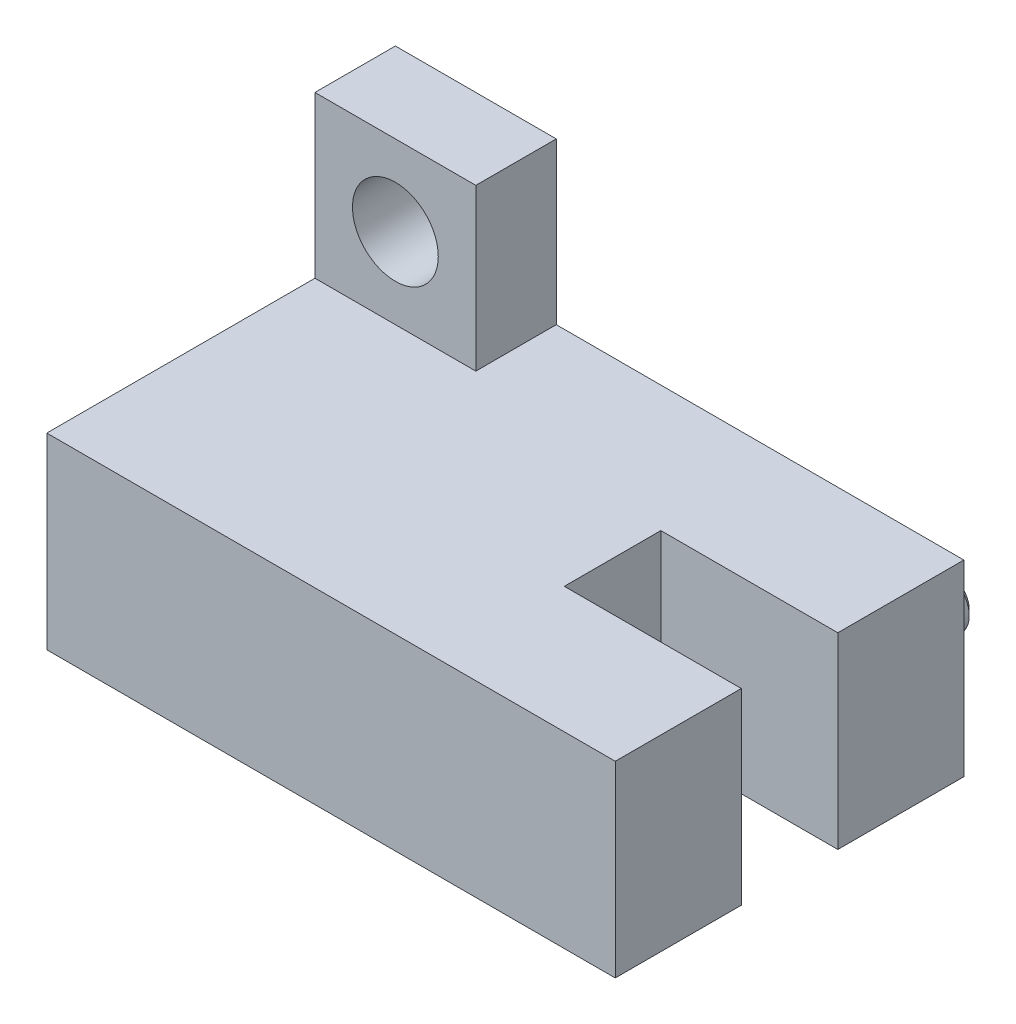
ISO-10303-21;
HEADER;
FILE_DESCRIPTION(('STEP AP214'),'2;1');
FILE_NAME('part.step','',(''),(''),'','','');
FILE_SCHEMA(('AUTOMOTIVE_DESIGN { 1 0 10303 214 1 1 1 1 }'));
ENDSEC;
DATA;
#1=APPLICATION_CONTEXT('core data for automotive mechanical design processes');
#2=APPLICATION_PROTOCOL_DEFINITION('international standard','automotive_design',2000,#1);
#3=PRODUCT_CONTEXT('',#1,'mechanical');
#4=PRODUCT('Part','Part','',(#3));
#5=PRODUCT_RELATED_PRODUCT_CATEGORY('part','',(#4));
#6=PRODUCT_DEFINITION_FORMATION('','',#4);
#7=PRODUCT_DEFINITION_CONTEXT('part definition',#1,'design');
#8=PRODUCT_DEFINITION('design','',#6,#7);
#9=PRODUCT_DEFINITION_SHAPE('','',#8);
#10=(LENGTH_UNIT() NAMED_UNIT(*) SI_UNIT(.MILLI.,.METRE.));
#11=(NAMED_UNIT(*) PLANE_ANGLE_UNIT() SI_UNIT($,.RADIAN.));
#12=(NAMED_UNIT(*) SI_UNIT($,.STERADIAN.) SOLID_ANGLE_UNIT());
#13=UNCERTAINTY_MEASURE_WITH_UNIT(LENGTH_MEASURE(1.E-05),#10,'distance_accuracy_value','');
#14=(GEOMETRIC_REPRESENTATION_CONTEXT(3) GLOBAL_UNCERTAINTY_ASSIGNED_CONTEXT((#13)) GLOBAL_UNIT_ASSIGNED_CONTEXT((#10,
#11,#12)) REPRESENTATION_CONTEXT('',''));
#15=CARTESIAN_POINT('',(0.,0.,0.));
#16=DIRECTION('',(0.,0.,1.));
#17=DIRECTION('',(1.,0.,0.));
#18=AXIS2_PLACEMENT_3D('',#15,#16,#17);
#19=CARTESIAN_POINT('',(-3.,-0.5,0.));
#20=DIRECTION('',(0.,0.,1.));
#21=DIRECTION('',(1.,0.,0.));
#22=AXIS2_PLACEMENT_3D('',#19,#20,#21);
#23=PLANE('',#22);
#24=CARTESIAN_POINT('',(0.,9.5,0.));
#25=DIRECTION('',(0.,0.,1.));
#26=DIRECTION('',(1.,0.,0.));
#27=AXIS2_PLACEMENT_3D('',#24,#25,#26);
#28=CIRCLE('',#27,1.6);
#29=CARTESIAN_POINT('',(1.6,9.5,0.));
#30=VERTEX_POINT('',#29);
#31=EDGE_CURVE('E181',#30,#30,#28,.T.);
#32=ORIENTED_EDGE('',*,*,#31,.T.);
#33=EDGE_LOOP('',(#32));
#34=FACE_BOUND('',#33,.T.);
#35=DIRECTION('',(0.,1.,0.));
#36=VECTOR('',#35,1.);
#37=CARTESIAN_POINT('',(3.,12.5,0.));
#38=LINE('',#37,#36);
#39=CARTESIAN_POINT('',(3.,6.5,0.));
#40=VERTEX_POINT('',#39);
#41=CARTESIAN_POINT('',(3.,12.5,0.));
#42=VERTEX_POINT('',#41);
#43=EDGE_CURVE('E192',#40,#42,#38,.T.);
#44=ORIENTED_EDGE('',*,*,#43,.F.);
#45=DIRECTION('',(1.,0.,0.));
#46=VECTOR('',#45,1.);
#47=CARTESIAN_POINT('',(-3.,6.5,0.));
#48=LINE('',#47,#46);
#49=CARTESIAN_POINT('',(18.2,6.5,0.));
#50=VERTEX_POINT('',#49);
#51=EDGE_CURVE('E151',#40,#50,#48,.T.);
#52=ORIENTED_EDGE('',*,*,#51,.T.);
#53=DIRECTION('',(0.,-1.,0.));
#54=VECTOR('',#53,1.);
#55=CARTESIAN_POINT('',(18.2,-0.500000000000003,0.));
#56=LINE('',#55,#54);
#57=CARTESIAN_POINT('',(18.2,-0.500000000000003,0.));
#58=VERTEX_POINT('',#57);
#59=EDGE_CURVE('E154',#50,#58,#56,.T.);
#60=ORIENTED_EDGE('',*,*,#59,.T.);
#61=DIRECTION('',(1.,0.,0.));
#62=VECTOR('',#61,1.);
#63=CARTESIAN_POINT('',(-3.,-0.5,0.));
#64=LINE('',#63,#62);
#65=CARTESIAN_POINT('',(-3.,-0.5,0.));
#66=VERTEX_POINT('',#65);
#67=EDGE_CURVE('E189',#66,#58,#64,.T.);
#68=ORIENTED_EDGE('',*,*,#67,.F.);
#69=DIRECTION('',(0.,-1.,0.));
#70=VECTOR('',#69,1.);
#71=CARTESIAN_POINT('',(-3.,12.5,0.));
#72=LINE('',#71,#70);
#73=CARTESIAN_POINT('',(-3.,12.5,0.));
#74=VERTEX_POINT('',#73);
#75=EDGE_CURVE('E187',#74,#66,#72,.T.);
#76=ORIENTED_EDGE('',*,*,#75,.F.);
#77=DIRECTION('',(-1.,0.,0.));
#78=VECTOR('',#77,1.);
#79=CARTESIAN_POINT('',(-3.,12.5,0.));
#80=LINE('',#79,#78);
#81=EDGE_CURVE('E194',#42,#74,#80,.T.);
#82=ORIENTED_EDGE('',*,*,#81,.F.);
#83=EDGE_LOOP('',(#44,#52,#60,#68,#76,#82));
#84=FACE_BOUND('',#83,.T.);
#85=CARTESIAN_POINT('',(15.6000000000031,2.99999999999295,0.));
#86=DIRECTION('',(0.,0.,1.));
#87=DIRECTION('',(1.,0.,0.));
#88=AXIS2_PLACEMENT_3D('',#85,#86,#87);
#89=CIRCLE('',#88,1.);
#90=CARTESIAN_POINT('',(16.6000000000031,2.99999999999295,0.));
#91=VERTEX_POINT('',#90);
#92=EDGE_CURVE('E133',#91,#91,#89,.F.);
#93=ORIENTED_EDGE('',*,*,#92,.F.);
#94=EDGE_LOOP('',(#93));
#95=FACE_BOUND('',#94,.T.);
#96=ADVANCED_FACE('F33',(#34,#84,#95),#23,.F.);
#97=CARTESIAN_POINT('',(18.2,-0.500000000000003,13.));
#98=DIRECTION('',(1.,0.,0.));
#99=DIRECTION('',(0.,0.,-1.));
#100=AXIS2_PLACEMENT_3D('',#97,#98,#99);
#101=PLANE('',#100);
#102=DIRECTION('',(0.,-1.,0.));
#103=VECTOR('',#102,1.);
#104=CARTESIAN_POINT('',(18.2,-0.500000000000003,8.3));
#105=LINE('',#104,#103);
#106=CARTESIAN_POINT('',(18.2,6.5,8.3));
#107=VERTEX_POINT('',#106);
#108=CARTESIAN_POINT('',(18.2,-0.500000000000003,8.3));
#109=VERTEX_POINT('',#108);
#110=EDGE_CURVE('E146',#107,#109,#105,.T.);
#111=ORIENTED_EDGE('',*,*,#110,.F.);
#112=DIRECTION('',(0.,0.,-1.));
#113=VECTOR('',#112,1.);
#114=CARTESIAN_POINT('',(18.2,6.5,13.));
#115=LINE('',#114,#113);
#116=CARTESIAN_POINT('',(18.2,6.5,13.));
#117=VERTEX_POINT('',#116);
#118=EDGE_CURVE('E175',#117,#107,#115,.T.);
#119=ORIENTED_EDGE('',*,*,#118,.F.);
#120=DIRECTION('',(0.,-1.,0.));
#121=VECTOR('',#120,1.);
#122=CARTESIAN_POINT('',(18.2,-0.500000000000003,13.));
#123=LINE('',#122,#121);
#124=CARTESIAN_POINT('',(18.2,-0.500000000000003,13.));
#125=VERTEX_POINT('',#124);
#126=EDGE_CURVE('E163',#117,#125,#123,.T.);
#127=ORIENTED_EDGE('',*,*,#126,.T.);
#128=DIRECTION('',(0.,0.,-1.));
#129=VECTOR('',#128,1.);
#130=CARTESIAN_POINT('',(18.2,-0.500000000000003,13.));
#131=LINE('',#130,#129);
#132=EDGE_CURVE('E170',#125,#109,#131,.T.);
#133=ORIENTED_EDGE('',*,*,#132,.T.);
#134=EDGE_LOOP('',(#111,#119,#127,#133));
#135=FACE_BOUND('',#134,.T.);
#136=ADVANCED_FACE('F229',(#135),#101,.T.);
#137=CARTESIAN_POINT('',(-3.,-0.5,3.));
#138=DIRECTION('',(0.,0.,1.));
#139=DIRECTION('',(1.,0.,0.));
#140=AXIS2_PLACEMENT_3D('',#137,#138,#139);
#141=PLANE('',#140);
#142=DIRECTION('',(-1.,0.,0.));
#143=VECTOR('',#142,1.);
#144=CARTESIAN_POINT('',(-3.,6.5,3.));
#145=LINE('',#144,#143);
#146=CARTESIAN_POINT('',(3.,6.5,3.));
#147=VERTEX_POINT('',#146);
#148=CARTESIAN_POINT('',(-3.,6.5,3.));
#149=VERTEX_POINT('',#148);
#150=EDGE_CURVE('E173',#147,#149,#145,.T.);
#151=ORIENTED_EDGE('',*,*,#150,.F.);
#152=DIRECTION('',(0.,1.,0.));
#153=VECTOR('',#152,1.);
#154=CARTESIAN_POINT('',(3.,12.5,3.));
#155=LINE('',#154,#153);
#156=CARTESIAN_POINT('',(3.,12.5,3.));
#157=VERTEX_POINT('',#156);
#158=EDGE_CURVE('E197',#147,#157,#155,.T.);
#159=ORIENTED_EDGE('',*,*,#158,.T.);
#160=DIRECTION('',(-1.,0.,0.));
#161=VECTOR('',#160,1.);
#162=CARTESIAN_POINT('',(-3.,12.5,3.));
#163=LINE('',#162,#161);
#164=CARTESIAN_POINT('',(-3.,12.5,3.));
#165=VERTEX_POINT('',#164);
#166=EDGE_CURVE('E199',#157,#165,#163,.T.);
#167=ORIENTED_EDGE('',*,*,#166,.T.);
#168=DIRECTION('',(0.,-1.,0.));
#169=VECTOR('',#168,1.);
#170=CARTESIAN_POINT('',(-3.,12.5,3.));
#171=LINE('',#170,#169);
#172=EDGE_CURVE('E56',#165,#149,#171,.T.);
#173=ORIENTED_EDGE('',*,*,#172,.T.);
#174=EDGE_LOOP('',(#151,#159,#167,#173));
#175=FACE_BOUND('',#174,.T.);
#176=CARTESIAN_POINT('',(0.,9.5,3.));
#177=DIRECTION('',(0.,0.,1.));
#178=DIRECTION('',(1.,0.,0.));
#179=AXIS2_PLACEMENT_3D('',#176,#177,#178);
#180=CIRCLE('',#179,1.6);
#181=CARTESIAN_POINT('',(1.6,9.5,3.));
#182=VERTEX_POINT('',#181);
#183=EDGE_CURVE('E184',#182,#182,#180,.T.);
#184=ORIENTED_EDGE('',*,*,#183,.F.);
#185=EDGE_LOOP('',(#184));
#186=FACE_BOUND('',#185,.T.);
#187=ADVANCED_FACE('F235',(#175,#186),#141,.T.);
#188=CARTESIAN_POINT('',(-3.,12.5,3.));
#189=DIRECTION('',(1.,0.,0.));
#190=DIRECTION('',(0.,1.,0.));
#191=AXIS2_PLACEMENT_3D('',#188,#189,#190);
#192=PLANE('',#191);
#193=ORIENTED_EDGE('',*,*,#75,.T.);
#194=DIRECTION('',(0.,0.,-1.));
#195=VECTOR('',#194,1.);
#196=CARTESIAN_POINT('',(-3.,-0.5,3.));
#197=LINE('',#196,#195);
#198=CARTESIAN_POINT('',(-3.,-0.5,13.));
#199=VERTEX_POINT('',#198);
#200=EDGE_CURVE('E207',#199,#66,#197,.T.);
#201=ORIENTED_EDGE('',*,*,#200,.F.);
#202=DIRECTION('',(0.,1.,0.));
#203=VECTOR('',#202,1.);
#204=CARTESIAN_POINT('',(-3.,-0.5,13.));
#205=LINE('',#204,#203);
#206=CARTESIAN_POINT('',(-3.,6.5,13.));
#207=VERTEX_POINT('',#206);
#208=EDGE_CURVE('E157',#199,#207,#205,.T.);
#209=ORIENTED_EDGE('',*,*,#208,.T.);
#210=DIRECTION('',(0.,0.,-1.));
#211=VECTOR('',#210,1.);
#212=CARTESIAN_POINT('',(-3.,6.5,13.));
#213=LINE('',#212,#211);
#214=EDGE_CURVE('E169',#207,#149,#213,.T.);
#215=ORIENTED_EDGE('',*,*,#214,.T.);
#216=ORIENTED_EDGE('',*,*,#172,.F.);
#217=DIRECTION('',(0.,0.,-1.));
#218=VECTOR('',#217,1.);
#219=CARTESIAN_POINT('',(-3.,12.5,3.));
#220=LINE('',#219,#218);
#221=EDGE_CURVE('E201',#165,#74,#220,.T.);
#222=ORIENTED_EDGE('',*,*,#221,.T.);
#223=EDGE_LOOP('',(#193,#201,#209,#215,#216,#222));
#224=FACE_BOUND('',#223,.T.);
#225=ADVANCED_FACE('F35',(#224),#192,.F.);
#226=CARTESIAN_POINT('',(-3.,-0.5,3.));
#227=DIRECTION('',(0.,1.,0.));
#228=DIRECTION('',(0.,0.,1.));
#229=AXIS2_PLACEMENT_3D('',#226,#227,#228);
#230=PLANE('',#229);
#231=DIRECTION('',(0.,0.,1.));
#232=VECTOR('',#231,1.);
#233=CARTESIAN_POINT('',(11.6,-0.5,3.));
#234=LINE('',#233,#232);
#235=CARTESIAN_POINT('',(11.6,-0.5,4.7));
#236=VERTEX_POINT('',#235);
#237=CARTESIAN_POINT('',(11.6,-0.5,8.3));
#238=VERTEX_POINT('',#237);
#239=EDGE_CURVE('E124',#236,#238,#234,.T.);
#240=ORIENTED_EDGE('',*,*,#239,.T.);
#241=DIRECTION('',(1.,0.,0.));
#242=VECTOR('',#241,1.);
#243=CARTESIAN_POINT('',(-3.,-0.5,8.3));
#244=LINE('',#243,#242);
#245=EDGE_CURVE('E148',#238,#109,#244,.T.);
#246=ORIENTED_EDGE('',*,*,#245,.T.);
#247=ORIENTED_EDGE('',*,*,#132,.F.);
#248=DIRECTION('',(-1.,0.,0.));
#249=VECTOR('',#248,1.);
#250=CARTESIAN_POINT('',(-3.,-0.5,13.));
#251=LINE('',#250,#249);
#252=EDGE_CURVE('E166',#125,#199,#251,.T.);
#253=ORIENTED_EDGE('',*,*,#252,.T.);
#254=ORIENTED_EDGE('',*,*,#200,.T.);
#255=ORIENTED_EDGE('',*,*,#67,.T.);
#256=CARTESIAN_POINT('',(18.2,-0.500000000000003,4.7));
#257=VERTEX_POINT('',#256);
#258=EDGE_CURVE('E174',#257,#58,#131,.T.);
#259=ORIENTED_EDGE('',*,*,#258,.F.);
#260=DIRECTION('',(-1.,0.,0.));
#261=VECTOR('',#260,1.);
#262=CARTESIAN_POINT('',(-3.,-0.5,4.7));
#263=LINE('',#262,#261);
#264=EDGE_CURVE('E143',#257,#236,#263,.T.);
#265=ORIENTED_EDGE('',*,*,#264,.T.);
#266=EDGE_LOOP('',(#240,#246,#247,#253,#254,#255,#259,#265));
#267=FACE_BOUND('',#266,.T.);
#268=ADVANCED_FACE('F252',(#267),#230,.F.);
#269=CARTESIAN_POINT('',(3.,12.5,3.));
#270=DIRECTION('',(-1.,0.,0.));
#271=DIRECTION('',(0.,-1.,0.));
#272=AXIS2_PLACEMENT_3D('',#269,#270,#271);
#273=PLANE('',#272);
#274=ORIENTED_EDGE('',*,*,#158,.F.);
#275=DIRECTION('',(0.,0.,-1.));
#276=VECTOR('',#275,1.);
#277=CARTESIAN_POINT('',(3.,6.5,3.));
#278=LINE('',#277,#276);
#279=EDGE_CURVE('E134',#147,#40,#278,.T.);
#280=ORIENTED_EDGE('',*,*,#279,.T.);
#281=ORIENTED_EDGE('',*,*,#43,.T.);
#282=DIRECTION('',(0.,0.,-1.));
#283=VECTOR('',#282,1.);
#284=CARTESIAN_POINT('',(3.,12.5,3.));
#285=LINE('',#284,#283);
#286=EDGE_CURVE('E204',#157,#42,#285,.T.);
#287=ORIENTED_EDGE('',*,*,#286,.F.);
#288=EDGE_LOOP('',(#274,#280,#281,#287));
#289=FACE_BOUND('',#288,.T.);
#290=ADVANCED_FACE('F249',(#289),#273,.F.);
#291=CARTESIAN_POINT('',(-3.,12.5,3.));
#292=DIRECTION('',(0.,-1.,0.));
#293=DIRECTION('',(0.,0.,-1.));
#294=AXIS2_PLACEMENT_3D('',#291,#292,#293);
#295=PLANE('',#294);
#296=ORIENTED_EDGE('',*,*,#81,.T.);
#297=ORIENTED_EDGE('',*,*,#221,.F.);
#298=ORIENTED_EDGE('',*,*,#166,.F.);
#299=ORIENTED_EDGE('',*,*,#286,.T.);
#300=EDGE_LOOP('',(#296,#297,#298,#299));
#301=FACE_BOUND('',#300,.T.);
#302=ADVANCED_FACE('F246',(#301),#295,.F.);
#303=CARTESIAN_POINT('',(0.,9.5,3.));
#304=DIRECTION('',(0.,0.,-1.));
#305=DIRECTION('',(-1.,0.,0.));
#306=AXIS2_PLACEMENT_3D('',#303,#304,#305);
#307=CYLINDRICAL_SURFACE('',#306,1.6);
#308=ORIENTED_EDGE('',*,*,#183,.T.);
#309=EDGE_LOOP('',(#308));
#310=FACE_BOUND('',#309,.T.);
#311=ORIENTED_EDGE('',*,*,#31,.F.);
#312=EDGE_LOOP('',(#311));
#313=FACE_BOUND('',#312,.T.);
#314=ADVANCED_FACE('F242',(#310,#313),#307,.F.);
#315=DIRECTION('',(0.,1.,0.));
#316=VECTOR('',#315,1.);
#317=CARTESIAN_POINT('',(18.2,-0.500000000000003,4.7));
#318=LINE('',#317,#316);
#319=CARTESIAN_POINT('',(18.2,6.5,4.7));
#320=VERTEX_POINT('',#319);
#321=EDGE_CURVE('E48',#257,#320,#318,.T.);
#322=ORIENTED_EDGE('',*,*,#321,.F.);
#323=ORIENTED_EDGE('',*,*,#258,.T.);
#324=ORIENTED_EDGE('',*,*,#59,.F.);
#325=EDGE_CURVE('E177',#320,#50,#115,.T.);
#326=ORIENTED_EDGE('',*,*,#325,.F.);
#327=EDGE_LOOP('',(#322,#323,#324,#326));
#328=FACE_BOUND('',#327,.T.);
#329=ADVANCED_FACE('F238',(#328),#101,.T.);
#330=CARTESIAN_POINT('',(-3.,6.5,13.));
#331=DIRECTION('',(0.,1.,0.));
#332=DIRECTION('',(-1.,0.,0.));
#333=AXIS2_PLACEMENT_3D('',#330,#331,#332);
#334=PLANE('',#333);
#335=DIRECTION('',(1.,0.,0.));
#336=VECTOR('',#335,1.);
#337=CARTESIAN_POINT('',(22.5378129394633,6.5,8.3));
#338=LINE('',#337,#336);
#339=CARTESIAN_POINT('',(11.6,6.5,8.3));
#340=VERTEX_POINT('',#339);
#341=EDGE_CURVE('E127',#340,#107,#338,.T.);
#342=ORIENTED_EDGE('',*,*,#341,.F.);
#343=DIRECTION('',(0.,0.,1.));
#344=VECTOR('',#343,1.);
#345=CARTESIAN_POINT('',(11.6,6.5,8.3));
#346=LINE('',#345,#344);
#347=CARTESIAN_POINT('',(11.6,6.5,4.7));
#348=VERTEX_POINT('',#347);
#349=EDGE_CURVE('E121',#348,#340,#346,.T.);
#350=ORIENTED_EDGE('',*,*,#349,.F.);
#351=DIRECTION('',(-1.,0.,0.));
#352=VECTOR('',#351,1.);
#353=CARTESIAN_POINT('',(-3.,6.5,4.7));
#354=LINE('',#353,#352);
#355=EDGE_CURVE('E129',#320,#348,#354,.T.);
#356=ORIENTED_EDGE('',*,*,#355,.F.);
#357=ORIENTED_EDGE('',*,*,#325,.T.);
#358=ORIENTED_EDGE('',*,*,#51,.F.);
#359=ORIENTED_EDGE('',*,*,#279,.F.);
#360=ORIENTED_EDGE('',*,*,#150,.T.);
#361=ORIENTED_EDGE('',*,*,#214,.F.);
#362=DIRECTION('',(1.,0.,0.));
#363=VECTOR('',#362,1.);
#364=CARTESIAN_POINT('',(-3.,6.5,13.));
#365=LINE('',#364,#363);
#366=EDGE_CURVE('E160',#207,#117,#365,.T.);
#367=ORIENTED_EDGE('',*,*,#366,.T.);
#368=ORIENTED_EDGE('',*,*,#118,.T.);
#369=EDGE_LOOP('',(#342,#350,#356,#357,#358,#359,#360,#361,#367,#368));
#370=FACE_BOUND('',#369,.T.);
#371=ADVANCED_FACE('F136',(#370),#334,.T.);
#372=CARTESIAN_POINT('',(-3.,6.5,13.));
#373=DIRECTION('',(0.,0.,-1.));
#374=DIRECTION('',(-1.,0.,0.));
#375=AXIS2_PLACEMENT_3D('',#372,#373,#374);
#376=PLANE('',#375);
#377=ORIENTED_EDGE('',*,*,#208,.F.);
#378=ORIENTED_EDGE('',*,*,#252,.F.);
#379=ORIENTED_EDGE('',*,*,#126,.F.);
#380=ORIENTED_EDGE('',*,*,#366,.F.);
#381=EDGE_LOOP('',(#377,#378,#379,#380));
#382=FACE_BOUND('',#381,.T.);
#383=ADVANCED_FACE('F275',(#382),#376,.F.);
#384=CARTESIAN_POINT('',(22.5378129394633,-6.7,8.3));
#385=DIRECTION('',(0.,0.,1.));
#386=DIRECTION('',(1.,0.,0.));
#387=AXIS2_PLACEMENT_3D('',#384,#385,#386);
#388=PLANE('',#387);
#389=DIRECTION('',(0.,1.,0.));
#390=VECTOR('',#389,1.);
#391=CARTESIAN_POINT('',(11.6,-6.7,8.3));
#392=LINE('',#391,#390);
#393=EDGE_CURVE('E126',#238,#340,#392,.T.);
#394=ORIENTED_EDGE('',*,*,#393,.T.);
#395=ORIENTED_EDGE('',*,*,#341,.T.);
#396=ORIENTED_EDGE('',*,*,#110,.T.);
#397=ORIENTED_EDGE('',*,*,#245,.F.);
#398=EDGE_LOOP('',(#394,#395,#396,#397));
#399=FACE_BOUND('',#398,.T.);
#400=ADVANCED_FACE('F279',(#399),#388,.F.);
#401=CARTESIAN_POINT('',(11.6,-6.7,8.3));
#402=DIRECTION('',(-1.,0.,0.));
#403=DIRECTION('',(0.,-1.,0.));
#404=AXIS2_PLACEMENT_3D('',#401,#402,#403);
#405=PLANE('',#404);
#406=DIRECTION('',(0.,1.,0.));
#407=VECTOR('',#406,1.);
#408=CARTESIAN_POINT('',(11.6,-6.7,4.7));
#409=LINE('',#408,#407);
#410=EDGE_CURVE('E117',#236,#348,#409,.T.);
#411=ORIENTED_EDGE('',*,*,#410,.T.);
#412=ORIENTED_EDGE('',*,*,#349,.T.);
#413=ORIENTED_EDGE('',*,*,#393,.F.);
#414=ORIENTED_EDGE('',*,*,#239,.F.);
#415=EDGE_LOOP('',(#411,#412,#413,#414));
#416=FACE_BOUND('',#415,.T.);
#417=ADVANCED_FACE('F118',(#416),#405,.F.);
#418=CARTESIAN_POINT('',(22.5378129394633,-6.7,4.7));
#419=DIRECTION('',(0.,0.,-1.));
#420=DIRECTION('',(-1.,0.,0.));
#421=AXIS2_PLACEMENT_3D('',#418,#419,#420);
#422=PLANE('',#421);
#423=ORIENTED_EDGE('',*,*,#321,.T.);
#424=ORIENTED_EDGE('',*,*,#355,.T.);
#425=ORIENTED_EDGE('',*,*,#410,.F.);
#426=ORIENTED_EDGE('',*,*,#264,.F.);
#427=EDGE_LOOP('',(#423,#424,#425,#426));
#428=FACE_BOUND('',#427,.T.);
#429=ADVANCED_FACE('F130',(#428),#422,.F.);
#430=CARTESIAN_POINT('',(15.6000000000031,2.99999999999295,-2.));
#431=DIRECTION('',(0.,0.,1.));
#432=DIRECTION('',(1.,0.,0.));
#433=AXIS2_PLACEMENT_3D('',#430,#431,#432);
#434=CYLINDRICAL_SURFACE('',#433,1.);
#435=CARTESIAN_POINT('',(15.6000000000031,2.99999999999295,-1.8));
#436=DIRECTION('',(0.,0.,-1.));
#437=DIRECTION('',(-1.,0.,0.));
#438=AXIS2_PLACEMENT_3D('',#435,#436,#437);
#439=CIRCLE('',#438,1.);
#440=CARTESIAN_POINT('',(14.6000000000031,2.99999999999295,-1.8));
#441=VERTEX_POINT('',#440);
#442=EDGE_CURVE('E11',#441,#441,#439,.F.);
#443=ORIENTED_EDGE('',*,*,#442,.T.);
#444=EDGE_LOOP('',(#443));
#445=FACE_BOUND('',#444,.T.);
#446=ORIENTED_EDGE('',*,*,#92,.T.);
#447=EDGE_LOOP('',(#446));
#448=FACE_BOUND('',#447,.T.);
#449=ADVANCED_FACE('F225',(#445,#448),#434,.T.);
#450=CARTESIAN_POINT('',(15.6000000000031,2.99999999999295,-2.));
#451=DIRECTION('',(0.,0.,-1.));
#452=DIRECTION('',(-1.,0.,0.));
#453=AXIS2_PLACEMENT_3D('',#450,#451,#452);
#454=PLANE('',#453);
#455=CARTESIAN_POINT('',(15.6000000000031,2.99999999999295,-2.));
#456=DIRECTION('',(0.,0.,-1.));
#457=DIRECTION('',(-1.,0.,0.));
#458=AXIS2_PLACEMENT_3D('',#455,#456,#457);
#459=CIRCLE('',#458,0.799999999999997);
#460=CARTESIAN_POINT('',(14.8000000000031,2.99999999999295,-2.));
#461=VERTEX_POINT('',#460);
#462=EDGE_CURVE('E41',#461,#461,#459,.T.);
#463=ORIENTED_EDGE('',*,*,#462,.T.);
#464=EDGE_LOOP('',(#463));
#465=FACE_BOUND('',#464,.T.);
#466=ADVANCED_FACE('F216',(#465),#454,.T.);
#467=CARTESIAN_POINT('',(15.6000000000031,2.99999999999295,-2.));
#468=DIRECTION('',(0.,0.,1.));
#469=DIRECTION('',(1.,0.,0.));
#470=AXIS2_PLACEMENT_3D('',#467,#468,#469);
#471=CONICAL_SURFACE('',#470,0.799999999999997,0.785398163397453);
#472=ORIENTED_EDGE('',*,*,#442,.F.);
#473=EDGE_LOOP('',(#472));
#474=FACE_BOUND('',#473,.T.);
#475=ORIENTED_EDGE('',*,*,#462,.F.);
#476=EDGE_LOOP('',(#475));
#477=FACE_BOUND('',#476,.T.);
#478=ADVANCED_FACE('F218',(#474,#477),#471,.T.);
#479=CLOSED_SHELL('',(#96,#136,#187,#225,#268,#290,#302,#314,#329,#371,#383,#400,#417,#429,#449,
#466,#478));
#480=MANIFOLD_SOLID_BREP('B2',#479);
#481=ADVANCED_BREP_SHAPE_REPRESENTATION('',(#18,#480),#14);
#482=SHAPE_DEFINITION_REPRESENTATION(#9,#481);
ENDSEC;
END-ISO-10303-21;
